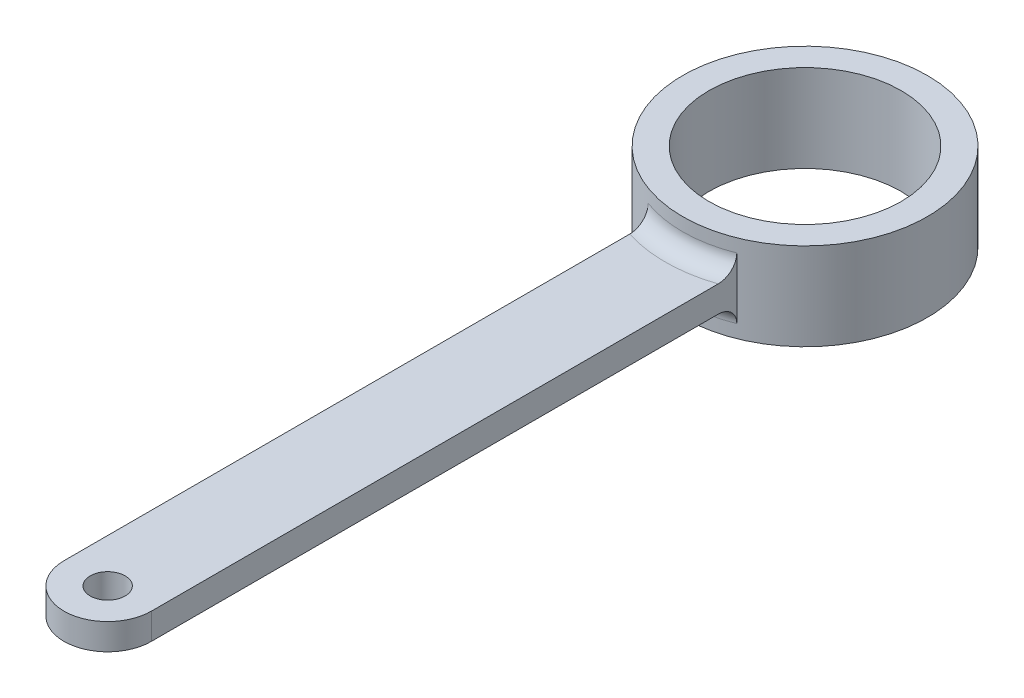
ISO-10303-21;
HEADER;
FILE_DESCRIPTION(('STEP AP214'),'2;1');
FILE_NAME('part.step','',(''),(''),'','','');
FILE_SCHEMA(('AUTOMOTIVE_DESIGN { 1 0 10303 214 1 1 1 1 }'));
ENDSEC;
DATA;
#1=APPLICATION_CONTEXT('core data for automotive mechanical design processes');
#2=APPLICATION_PROTOCOL_DEFINITION('international standard','automotive_design',2000,#1);
#3=PRODUCT_CONTEXT('',#1,'mechanical');
#4=PRODUCT('Part','Part','',(#3));
#5=PRODUCT_RELATED_PRODUCT_CATEGORY('part','',(#4));
#6=PRODUCT_DEFINITION_FORMATION('','',#4);
#7=PRODUCT_DEFINITION_CONTEXT('part definition',#1,'design');
#8=PRODUCT_DEFINITION('design','',#6,#7);
#9=PRODUCT_DEFINITION_SHAPE('','',#8);
#10=(LENGTH_UNIT() NAMED_UNIT(*) SI_UNIT(.MILLI.,.METRE.));
#11=(NAMED_UNIT(*) PLANE_ANGLE_UNIT() SI_UNIT($,.RADIAN.));
#12=(NAMED_UNIT(*) SI_UNIT($,.STERADIAN.) SOLID_ANGLE_UNIT());
#13=UNCERTAINTY_MEASURE_WITH_UNIT(LENGTH_MEASURE(1.E-05),#10,'distance_accuracy_value','');
#14=(GEOMETRIC_REPRESENTATION_CONTEXT(3) GLOBAL_UNCERTAINTY_ASSIGNED_CONTEXT((#13)) GLOBAL_UNIT_ASSIGNED_CONTEXT((#10,
#11,#12)) REPRESENTATION_CONTEXT('',''));
#15=CARTESIAN_POINT('',(0.,0.,0.));
#16=DIRECTION('',(0.,0.,1.));
#17=DIRECTION('',(1.,0.,0.));
#18=AXIS2_PLACEMENT_3D('',#15,#16,#17);
#19=CARTESIAN_POINT('',(0.,2.5,0.));
#20=DIRECTION('',(0.,-1.,0.));
#21=DIRECTION('',(0.,0.,-1.));
#22=AXIS2_PLACEMENT_3D('',#19,#20,#21);
#23=CYLINDRICAL_SURFACE('',#22,7.);
#24=CARTESIAN_POINT('',(0.,-2.5,0.));
#25=DIRECTION('',(0.,1.,0.));
#26=DIRECTION('',(0.,0.,1.));
#27=AXIS2_PLACEMENT_3D('',#24,#25,#26);
#28=CIRCLE('',#27,7.);
#29=CARTESIAN_POINT('',(0.,-2.5,7.));
#30=VERTEX_POINT('',#29);
#31=EDGE_CURVE('E122',#30,#30,#28,.T.);
#32=ORIENTED_EDGE('',*,*,#31,.T.);
#33=EDGE_LOOP('',(#32));
#34=FACE_BOUND('',#33,.T.);
#35=CARTESIAN_POINT('',(0.,2.5,0.));
#36=DIRECTION('',(0.,1.,0.));
#37=DIRECTION('',(0.,0.,1.));
#38=AXIS2_PLACEMENT_3D('',#35,#36,#37);
#39=CIRCLE('',#38,7.);
#40=CARTESIAN_POINT('',(0.,2.5,7.));
#41=VERTEX_POINT('',#40);
#42=EDGE_CURVE('E124',#41,#41,#39,.T.);
#43=ORIENTED_EDGE('',*,*,#42,.F.);
#44=EDGE_LOOP('',(#43));
#45=FACE_BOUND('',#44,.T.);
#46=CARTESIAN_POINT('',(0.,-1.75,0.));
#47=DIRECTION('',(0.,1.,0.));
#48=DIRECTION('',(0.,0.,1.));
#49=AXIS2_PLACEMENT_3D('',#46,#47,#48);
#50=CIRCLE('',#49,7.);
#51=CARTESIAN_POINT('',(2.59565300613237,-1.75,6.50096804112711));
#52=VERTEX_POINT('',#51);
#53=CARTESIAN_POINT('',(-2.40434699386764,-1.75,6.57412469710453));
#54=VERTEX_POINT('',#53);
#55=EDGE_CURVE('E132',#52,#54,#50,.F.);
#56=ORIENTED_EDGE('',*,*,#55,.T.);
#57=DIRECTION('',(0.,-1.,0.));
#58=VECTOR('',#57,1.);
#59=CARTESIAN_POINT('',(-2.40434699386764,0.75,6.57412469710453));
#60=LINE('',#59,#58);
#61=CARTESIAN_POINT('',(-2.40434699386764,1.75,6.57412469710453));
#62=VERTEX_POINT('',#61);
#63=EDGE_CURVE('E117',#62,#54,#60,.T.);
#64=ORIENTED_EDGE('',*,*,#63,.F.);
#65=CARTESIAN_POINT('',(0.,1.75,0.));
#66=DIRECTION('',(0.,1.,0.));
#67=DIRECTION('',(0.,0.,1.));
#68=AXIS2_PLACEMENT_3D('',#65,#66,#67);
#69=CIRCLE('',#68,7.);
#70=CARTESIAN_POINT('',(2.59565300613237,1.75,6.50096804112711));
#71=VERTEX_POINT('',#70);
#72=EDGE_CURVE('E127',#62,#71,#69,.T.);
#73=ORIENTED_EDGE('',*,*,#72,.T.);
#74=DIRECTION('',(0.,-1.,0.));
#75=VECTOR('',#74,1.);
#76=CARTESIAN_POINT('',(2.59565300613237,0.75,6.50096804112711));
#77=LINE('',#76,#75);
#78=EDGE_CURVE('E112',#71,#52,#77,.T.);
#79=ORIENTED_EDGE('',*,*,#78,.T.);
#80=EDGE_LOOP('',(#56,#64,#73,#79));
#81=FACE_BOUND('',#80,.T.);
#82=ADVANCED_FACE('F32',(#34,#45,#81),#23,.T.);
#83=CARTESIAN_POINT('',(0.,2.5,0.));
#84=DIRECTION('',(0.,1.,0.));
#85=DIRECTION('',(0.,0.,1.));
#86=AXIS2_PLACEMENT_3D('',#83,#84,#85);
#87=PLANE('',#86);
#88=ORIENTED_EDGE('',*,*,#42,.T.);
#89=EDGE_LOOP('',(#88));
#90=FACE_BOUND('',#89,.T.);
#91=CARTESIAN_POINT('',(0.,2.5,0.));
#92=DIRECTION('',(0.,1.,0.));
#93=DIRECTION('',(0.,0.,1.));
#94=AXIS2_PLACEMENT_3D('',#91,#92,#93);
#95=CIRCLE('',#94,5.5);
#96=CARTESIAN_POINT('',(0.,2.5,5.5));
#97=VERTEX_POINT('',#96);
#98=EDGE_CURVE('E115',#97,#97,#95,.T.);
#99=ORIENTED_EDGE('',*,*,#98,.F.);
#100=EDGE_LOOP('',(#99));
#101=FACE_BOUND('',#100,.T.);
#102=ADVANCED_FACE('F163',(#90,#101),#87,.T.);
#103=CARTESIAN_POINT('',(0.,-2.5,0.));
#104=DIRECTION('',(0.,1.,0.));
#105=DIRECTION('',(0.,0.,1.));
#106=AXIS2_PLACEMENT_3D('',#103,#104,#105);
#107=PLANE('',#106);
#108=ORIENTED_EDGE('',*,*,#31,.F.);
#109=EDGE_LOOP('',(#108));
#110=FACE_BOUND('',#109,.T.);
#111=CARTESIAN_POINT('',(0.,-2.5,0.));
#112=DIRECTION('',(0.,1.,0.));
#113=DIRECTION('',(0.,0.,1.));
#114=AXIS2_PLACEMENT_3D('',#111,#112,#113);
#115=CIRCLE('',#114,5.5);
#116=CARTESIAN_POINT('',(0.,-2.5,5.5));
#117=VERTEX_POINT('',#116);
#118=EDGE_CURVE('E111',#117,#117,#115,.T.);
#119=ORIENTED_EDGE('',*,*,#118,.T.);
#120=EDGE_LOOP('',(#119));
#121=FACE_BOUND('',#120,.T.);
#122=ADVANCED_FACE('F165',(#110,#121),#107,.F.);
#123=CARTESIAN_POINT('',(0.,2.5,0.));
#124=DIRECTION('',(0.,-1.,0.));
#125=DIRECTION('',(0.,0.,-1.));
#126=AXIS2_PLACEMENT_3D('',#123,#124,#125);
#127=CYLINDRICAL_SURFACE('',#126,5.5);
#128=ORIENTED_EDGE('',*,*,#98,.T.);
#129=EDGE_LOOP('',(#128));
#130=FACE_BOUND('',#129,.T.);
#131=ORIENTED_EDGE('',*,*,#118,.F.);
#132=EDGE_LOOP('',(#131));
#133=FACE_BOUND('',#132,.T.);
#134=ADVANCED_FACE('F168',(#130,#133),#127,.F.);
#135=CARTESIAN_POINT('',(0.0956530061323665,0.75,40.));
#136=DIRECTION('',(0.,1.,0.));
#137=DIRECTION('',(0.,0.,1.));
#138=AXIS2_PLACEMENT_3D('',#135,#136,#137);
#139=PLANE('',#138);
#140=DIRECTION('',(0.,0.,-1.));
#141=VECTOR('',#140,1.);
#142=CARTESIAN_POINT('',(2.59565300613237,0.75,40.));
#143=LINE('',#142,#141);
#144=CARTESIAN_POINT('',(2.59565300613237,0.75,40.));
#145=VERTEX_POINT('',#144);
#146=CARTESIAN_POINT('',(2.59565300613237,0.75,7.56720460089166));
#147=VERTEX_POINT('',#146);
#148=EDGE_CURVE('E88',#145,#147,#143,.T.);
#149=ORIENTED_EDGE('',*,*,#148,.T.);
#150=CARTESIAN_POINT('',(0.,0.75,0.));
#151=DIRECTION('',(0.,1.,0.));
#152=DIRECTION('',(0.,0.,1.));
#153=AXIS2_PLACEMENT_3D('',#150,#151,#152);
#154=CIRCLE('',#153,8.);
#155=CARTESIAN_POINT('',(-2.40434699386763,0.75,7.63014518427268));
#156=VERTEX_POINT('',#155);
#157=EDGE_CURVE('E137',#147,#156,#154,.F.);
#158=ORIENTED_EDGE('',*,*,#157,.T.);
#159=DIRECTION('',(0.,0.,1.));
#160=VECTOR('',#159,1.);
#161=CARTESIAN_POINT('',(-2.40434699386763,0.75,40.));
#162=LINE('',#161,#160);
#163=CARTESIAN_POINT('',(-2.40434699386763,0.75,40.));
#164=VERTEX_POINT('',#163);
#165=EDGE_CURVE('E96',#156,#164,#162,.T.);
#166=ORIENTED_EDGE('',*,*,#165,.T.);
#167=CARTESIAN_POINT('',(0.0956530061323665,0.75,40.));
#168=DIRECTION('',(0.,1.,0.));
#169=DIRECTION('',(0.,0.,1.));
#170=AXIS2_PLACEMENT_3D('',#167,#168,#169);
#171=CIRCLE('',#170,2.5);
#172=EDGE_CURVE('E97',#164,#145,#171,.T.);
#173=ORIENTED_EDGE('',*,*,#172,.T.);
#174=EDGE_LOOP('',(#149,#158,#166,#173));
#175=FACE_BOUND('',#174,.T.);
#176=CARTESIAN_POINT('',(0.0956530061323665,0.75,40.));
#177=DIRECTION('',(0.,1.,0.));
#178=DIRECTION('',(0.,0.,1.));
#179=AXIS2_PLACEMENT_3D('',#176,#177,#178);
#180=CIRCLE('',#179,1.);
#181=CARTESIAN_POINT('',(0.0956530061323665,0.75,41.));
#182=VERTEX_POINT('',#181);
#183=EDGE_CURVE('E206',#182,#182,#180,.T.);
#184=ORIENTED_EDGE('',*,*,#183,.F.);
#185=EDGE_LOOP('',(#184));
#186=FACE_BOUND('',#185,.T.);
#187=ADVANCED_FACE('F100',(#175,#186),#139,.T.);
#188=CARTESIAN_POINT('',(0.0956530061323665,-0.75,40.));
#189=DIRECTION('',(0.,1.,0.));
#190=DIRECTION('',(0.,0.,1.));
#191=AXIS2_PLACEMENT_3D('',#188,#189,#190);
#192=PLANE('',#191);
#193=DIRECTION('',(0.,0.,1.));
#194=VECTOR('',#193,1.);
#195=CARTESIAN_POINT('',(-2.40434699386763,-0.75,40.));
#196=LINE('',#195,#194);
#197=CARTESIAN_POINT('',(-2.40434699386763,-0.75,7.63014518427268));
#198=VERTEX_POINT('',#197);
#199=CARTESIAN_POINT('',(-2.40434699386763,-0.75,40.));
#200=VERTEX_POINT('',#199);
#201=EDGE_CURVE('E106',#198,#200,#196,.T.);
#202=ORIENTED_EDGE('',*,*,#201,.F.);
#203=CARTESIAN_POINT('',(0.,-0.75,0.));
#204=DIRECTION('',(0.,1.,0.));
#205=DIRECTION('',(0.,0.,1.));
#206=AXIS2_PLACEMENT_3D('',#203,#204,#205);
#207=CIRCLE('',#206,8.);
#208=CARTESIAN_POINT('',(2.59565300613237,-0.75,7.56720460089166));
#209=VERTEX_POINT('',#208);
#210=EDGE_CURVE('E135',#198,#209,#207,.T.);
#211=ORIENTED_EDGE('',*,*,#210,.T.);
#212=DIRECTION('',(0.,0.,-1.));
#213=VECTOR('',#212,1.);
#214=CARTESIAN_POINT('',(2.59565300613237,-0.75,40.));
#215=LINE('',#214,#213);
#216=CARTESIAN_POINT('',(2.59565300613237,-0.75,40.));
#217=VERTEX_POINT('',#216);
#218=EDGE_CURVE('E198',#217,#209,#215,.T.);
#219=ORIENTED_EDGE('',*,*,#218,.F.);
#220=CARTESIAN_POINT('',(0.0956530061323665,-0.75,40.));
#221=DIRECTION('',(0.,1.,0.));
#222=DIRECTION('',(0.,0.,1.));
#223=AXIS2_PLACEMENT_3D('',#220,#221,#222);
#224=CIRCLE('',#223,2.5);
#225=EDGE_CURVE('E110',#200,#217,#224,.T.);
#226=ORIENTED_EDGE('',*,*,#225,.F.);
#227=EDGE_LOOP('',(#202,#211,#219,#226));
#228=FACE_BOUND('',#227,.T.);
#229=CARTESIAN_POINT('',(0.0956530061323665,-0.75,40.));
#230=DIRECTION('',(0.,1.,0.));
#231=DIRECTION('',(0.,0.,1.));
#232=AXIS2_PLACEMENT_3D('',#229,#230,#231);
#233=CIRCLE('',#232,1.);
#234=CARTESIAN_POINT('',(0.0956530061323665,-0.75,41.));
#235=VERTEX_POINT('',#234);
#236=EDGE_CURVE('E211',#235,#235,#233,.T.);
#237=ORIENTED_EDGE('',*,*,#236,.T.);
#238=EDGE_LOOP('',(#237));
#239=FACE_BOUND('',#238,.T.);
#240=ADVANCED_FACE('F177',(#228,#239),#192,.F.);
#241=CARTESIAN_POINT('',(0.0956530061323665,0.75,40.));
#242=DIRECTION('',(0.,-1.,0.));
#243=DIRECTION('',(0.,0.,-1.));
#244=AXIS2_PLACEMENT_3D('',#241,#242,#243);
#245=CYLINDRICAL_SURFACE('',#244,2.5);
#246=ORIENTED_EDGE('',*,*,#225,.T.);
#247=DIRECTION('',(0.,-1.,0.));
#248=VECTOR('',#247,1.);
#249=CARTESIAN_POINT('',(2.59565300613237,0.75,40.));
#250=LINE('',#249,#248);
#251=EDGE_CURVE('E93',#145,#217,#250,.T.);
#252=ORIENTED_EDGE('',*,*,#251,.F.);
#253=ORIENTED_EDGE('',*,*,#172,.F.);
#254=DIRECTION('',(0.,-1.,0.));
#255=VECTOR('',#254,1.);
#256=CARTESIAN_POINT('',(-2.40434699386763,0.75,40.));
#257=LINE('',#256,#255);
#258=EDGE_CURVE('E193',#164,#200,#257,.T.);
#259=ORIENTED_EDGE('',*,*,#258,.T.);
#260=EDGE_LOOP('',(#246,#252,#253,#259));
#261=FACE_BOUND('',#260,.T.);
#262=ADVANCED_FACE('F108',(#261),#245,.T.);
#263=CARTESIAN_POINT('',(2.59565300613237,0.75,40.));
#264=DIRECTION('',(-1.,0.,0.));
#265=DIRECTION('',(0.,0.,1.));
#266=AXIS2_PLACEMENT_3D('',#263,#264,#265);
#267=PLANE('',#266);
#268=ORIENTED_EDGE('',*,*,#218,.T.);
#269=CARTESIAN_POINT('',(2.59565300613237,-0.75,7.56720460089167));
#270=CARTESIAN_POINT('',(2.59565300613237,-0.749967191618016,7.50451355800079));
#271=CARTESIAN_POINT('',(2.59565300613237,-0.755273207592061,7.44183053267779));
#272=CARTESIAN_POINT('',(2.59565300613237,-0.776246098878356,7.31818058480668));
#273=CARTESIAN_POINT('',(2.59565300613237,-0.7919195489353,7.257214776867));
#274=CARTESIAN_POINT('',(2.59565300613237,-0.833324359570755,7.13874151829163));
#275=CARTESIAN_POINT('',(2.59565300613237,-0.859062815961786,7.08123654061144));
#276=CARTESIAN_POINT('',(2.59565300613237,-0.920018319774298,6.97150578878896));
#277=CARTESIAN_POINT('',(2.59565300613237,-0.955231011299848,6.91927760371744));
#278=CARTESIAN_POINT('',(2.59565300613237,-1.03348483079806,6.82289538224537));
#279=CARTESIAN_POINT('',(2.59565300613237,-1.07634150943895,6.778591980932));
#280=CARTESIAN_POINT('',(2.59565300613237,-1.16932522605815,6.69836401329832));
#281=CARTESIAN_POINT('',(2.59565300613237,-1.21945182168122,6.66243893752565));
#282=CARTESIAN_POINT('',(2.59565300613237,-1.32229167777913,6.60241340638298));
#283=CARTESIAN_POINT('',(2.59565300613237,-1.374663910087,6.57772814209444));
#284=CARTESIAN_POINT('',(2.59565300613237,-1.48297093006899,6.53823930053503));
#285=CARTESIAN_POINT('',(2.59565300613237,-1.53889950472845,6.52341898181601));
#286=CARTESIAN_POINT('',(2.59565300613237,-1.62115839328606,6.50957782979631));
#287=CARTESIAN_POINT('',(2.59565300613237,-1.64683833681778,6.50635060117731));
#288=CARTESIAN_POINT('',(2.59565300613237,-1.69834080136864,6.5020473204653));
#289=CARTESIAN_POINT('',(2.59565300613237,-1.72416306599135,6.50096819881171));
#290=CARTESIAN_POINT('',(2.59565300613237,-1.75,6.5009680411271));
#291=B_SPLINE_CURVE_WITH_KNOTS('',3,(#269,#270,#271,#272,#273,#274,#275,#276,#277,#278,#279,
#280,#281,#282,#283,#284,#285,#286,#287,#288,#289,#290),.UNSPECIFIED.,.F.,.F.,(4,2,2,2,2,2,2,2,
2,2,4),(0.,0.187841420387833,0.375802079050729,0.563895489254461,0.751902568540989,
0.935870295355445,1.11982683291239,1.29263149814454,1.46514214992459,1.54271242813209,
1.62017178165606),.UNSPECIFIED.);
#292=EDGE_CURVE('E146',#209,#52,#291,.T.);
#293=ORIENTED_EDGE('',*,*,#292,.T.);
#294=ORIENTED_EDGE('',*,*,#78,.F.);
#295=CARTESIAN_POINT('',(2.59565300613237,1.75,6.50096804112711));
#296=CARTESIAN_POINT('',(2.59565300613237,1.72324971361133,6.50096701285888));
#297=CARTESIAN_POINT('',(2.59565300613237,1.69651287144223,6.50212461765312));
#298=CARTESIAN_POINT('',(2.59565300613237,1.64324340133514,6.5067346327404));
#299=CARTESIAN_POINT('',(2.59565300613237,1.61671073109249,6.51018655394862));
#300=CARTESIAN_POINT('',(2.59565300613237,1.53786290085643,6.52391687239184));
#301=CARTESIAN_POINT('',(2.59565300613237,1.48609725780734,6.53757020814757));
#302=CARTESIAN_POINT('',(2.59565300613237,1.38563070411865,6.57331935013671));
#303=CARTESIAN_POINT('',(2.59565300613237,1.33692883992691,6.5954125143164));
#304=CARTESIAN_POINT('',(2.59565300613237,1.24374381278024,6.64721647019553));
#305=CARTESIAN_POINT('',(2.59565300613237,1.19926252393207,6.67693062443859));
#306=CARTESIAN_POINT('',(2.59565300613237,1.11418748567707,6.74403895577305));
#307=CARTESIAN_POINT('',(2.59565300613237,1.07376472992852,6.78164936008533));
#308=CARTESIAN_POINT('',(2.59565300613237,0.999322222231609,6.86274483930424));
#309=CARTESIAN_POINT('',(2.59565300613237,0.965304368131877,6.90623164892372));
#310=CARTESIAN_POINT('',(2.59565300613237,0.902274467115865,7.00092831294896));
#311=CARTESIAN_POINT('',(2.59565300613237,0.873744982748008,7.05245928550288));
#312=CARTESIAN_POINT('',(2.59565300613237,0.825238076681609,7.15940258363923));
#313=CARTESIAN_POINT('',(2.59565300613237,0.805261730380197,7.21481539627186));
#314=CARTESIAN_POINT('',(2.59565300613237,0.776574642902735,7.31958704762955));
#315=CARTESIAN_POINT('',(2.59565300613237,0.766625698749371,7.36861152810742));
#316=CARTESIAN_POINT('',(2.59565300613237,0.753337021663266,7.46748835478582));
#317=CARTESIAN_POINT('',(2.59565300613237,0.749989433896567,7.5173396458344));
#318=CARTESIAN_POINT('',(2.59565300613237,0.75,7.56720460089167));
#319=B_SPLINE_CURVE_WITH_KNOTS('',3,(#295,#296,#297,#298,#299,#300,#301,#302,#303,#304,#305,
#306,#307,#308,#309,#310,#311,#312,#313,#314,#315,#316,#317,#318),.UNSPECIFIED.,.F.,.F.,(4,2,2,
2,2,2,2,2,2,2,2,4),(0.,0.080199452112484,0.160381813399797,0.320152520407001,0.479873252780814,
0.639664578953307,0.804593963599952,0.969572142139731,1.14550822520554,1.32146642245181,
1.47110319379581,1.62056180737287),.UNSPECIFIED.);
#320=EDGE_CURVE('E11',#71,#147,#319,.T.);
#321=ORIENTED_EDGE('',*,*,#320,.T.);
#322=ORIENTED_EDGE('',*,*,#148,.F.);
#323=ORIENTED_EDGE('',*,*,#251,.T.);
#324=EDGE_LOOP('',(#268,#293,#294,#321,#322,#323));
#325=FACE_BOUND('',#324,.T.);
#326=ADVANCED_FACE('F91',(#325),#267,.F.);
#327=CARTESIAN_POINT('',(-2.40434699386763,0.75,40.));
#328=DIRECTION('',(1.,0.,0.));
#329=DIRECTION('',(0.,0.,-1.));
#330=AXIS2_PLACEMENT_3D('',#327,#328,#329);
#331=PLANE('',#330);
#332=ORIENTED_EDGE('',*,*,#63,.T.);
#333=CARTESIAN_POINT('',(-2.40434699386764,-1.75,6.57412469710453));
#334=CARTESIAN_POINT('',(-2.40434699386764,-1.72304858983152,6.57412384620897));
#335=CARTESIAN_POINT('',(-2.40434699386763,-1.69611062042336,6.57528565327569));
#336=CARTESIAN_POINT('',(-2.40434699386763,-1.64243838384408,6.57991362086383));
#337=CARTESIAN_POINT('',(-2.40434699386763,-1.6157040793063,6.58337934785501));
#338=CARTESIAN_POINT('',(-2.40434699386763,-1.53623784052171,6.59717017570939));
#339=CARTESIAN_POINT('',(-2.40434699386763,-1.48405623875785,6.61088925405417));
#340=CARTESIAN_POINT('',(-2.40434699386763,-1.3827686683026,6.64684435848325));
#341=CARTESIAN_POINT('',(-2.40434699386763,-1.33366210167369,6.66907872275772));
#342=CARTESIAN_POINT('',(-2.40434699386763,-1.23972102714485,6.72126216724701));
#343=CARTESIAN_POINT('',(-2.40434699386763,-1.19488803957112,6.75121397901628));
#344=CARTESIAN_POINT('',(-2.40434699386763,-1.10938304187433,6.81876957526786));
#345=CARTESIAN_POINT('',(-2.40434699386763,-1.0688606216883,6.85656227539508));
#346=CARTESIAN_POINT('',(-2.40434699386763,-0.994315568071022,6.93809069449535));
#347=CARTESIAN_POINT('',(-2.40434699386763,-0.960294817881679,6.98182812913247));
#348=CARTESIAN_POINT('',(-2.40434699386763,-0.897707232201834,7.07664580519353));
#349=CARTESIAN_POINT('',(-2.40434699386763,-0.869557774641766,7.12800145652281));
#350=CARTESIAN_POINT('',(-2.40434699386763,-0.821854661558519,7.23456055686268));
#351=CARTESIAN_POINT('',(-2.40434699386763,-0.802301208591336,7.28976409650927));
#352=CARTESIAN_POINT('',(-2.40434699386763,-0.774894416678548,7.3924396270475));
#353=CARTESIAN_POINT('',(-2.40434699386763,-0.765573055833443,7.43952624135226));
#354=CARTESIAN_POINT('',(-2.40434699386763,-0.753124668655996,7.5344527147288));
#355=CARTESIAN_POINT('',(-2.40434699386763,-0.749990133734796,7.58229158962735));
#356=CARTESIAN_POINT('',(-2.40434699386763,-0.75,7.63014518427269));
#357=B_SPLINE_CURVE_WITH_KNOTS('',3,(#333,#334,#335,#336,#337,#338,#339,#340,#341,#342,#343,
#344,#345,#346,#347,#348,#349,#350,#351,#352,#353,#354,#355,#356),.UNSPECIFIED.,.F.,.F.,(4,2,2,
2,2,2,2,2,2,2,2,4),(0.,0.0808027864681223,0.161590372521452,0.322613876638009,0.483605972038513,
0.64465512830154,0.810163672709614,0.975720085091735,1.15064163158965,1.32556729971277,
1.46917331905182,1.61260494473333),.UNSPECIFIED.);
#358=EDGE_CURVE('E139',#54,#198,#357,.T.);
#359=ORIENTED_EDGE('',*,*,#358,.T.);
#360=ORIENTED_EDGE('',*,*,#201,.T.);
#361=ORIENTED_EDGE('',*,*,#258,.F.);
#362=ORIENTED_EDGE('',*,*,#165,.F.);
#363=CARTESIAN_POINT('',(-2.40434699386763,0.75,7.63014518427269));
#364=CARTESIAN_POINT('',(-2.40434699386763,0.74996461614881,7.56847490876169));
#365=CARTESIAN_POINT('',(-2.40434699386763,0.755187855954402,7.50681359950979));
#366=CARTESIAN_POINT('',(-2.40434699386763,0.775829122943631,7.38519453380251));
#367=CARTESIAN_POINT('',(-2.40434699386763,0.791251326927976,7.32523748579309));
#368=CARTESIAN_POINT('',(-2.40434699386763,0.8319812837931,7.20872664570127));
#369=CARTESIAN_POINT('',(-2.40434699386763,0.857295694963676,7.15217517551068));
#370=CARTESIAN_POINT('',(-2.40434699386763,0.917213269774785,7.04424290904672));
#371=CARTESIAN_POINT('',(-2.40434699386763,0.951812540171268,6.99285995794327));
#372=CARTESIAN_POINT('',(-2.40434699386763,1.02878581642799,6.89779918823012));
#373=CARTESIAN_POINT('',(-2.40434699386763,1.07100918120565,6.8539996594116));
#374=CARTESIAN_POINT('',(-2.40434699386763,1.16257614915583,6.77456571534452));
#375=CARTESIAN_POINT('',(-2.40434699386763,1.21191970943735,6.73893125091416));
#376=CARTESIAN_POINT('',(-2.40434699386763,1.31362121619751,6.67886611861998));
#377=CARTESIAN_POINT('',(-2.40434699386763,1.36569622673537,6.65395593476203));
#378=CARTESIAN_POINT('',(-2.40434699386763,1.47342714771799,6.61385240628448));
#379=CARTESIAN_POINT('',(-2.40434699386763,1.52907749315806,6.59864434517991));
#380=CARTESIAN_POINT('',(-2.40434699386763,1.612730792757,6.58379422795612));
#381=CARTESIAN_POINT('',(-2.40434699386763,1.64007770012551,6.58016998709225));
#382=CARTESIAN_POINT('',(-2.40434699386763,1.69494476780129,6.5753367259632));
#383=CARTESIAN_POINT('',(-2.40434699386763,1.72246462571815,6.57412427162028));
#384=CARTESIAN_POINT('',(-2.40434699386763,1.75,6.57412469710451));
#385=B_SPLINE_CURVE_WITH_KNOTS('',3,(#363,#364,#365,#366,#367,#368,#369,#370,#371,#372,#373,
#374,#375,#376,#377,#378,#379,#380,#381,#382,#383,#384),.UNSPECIFIED.,.F.,.F.,(4,2,2,2,2,2,2,2,
2,2,4),(0.,0.184780441000396,0.369636602378356,0.554617402453264,0.739520758904971,
0.921106400054528,1.10269094740462,1.27499529825982,1.44703766711833,1.52970438216945,
1.6122533058188),.UNSPECIFIED.);
#386=EDGE_CURVE('E46',#156,#62,#385,.T.);
#387=ORIENTED_EDGE('',*,*,#386,.T.);
#388=EDGE_LOOP('',(#332,#359,#360,#361,#362,#387));
#389=FACE_BOUND('',#388,.T.);
#390=ADVANCED_FACE('F151',(#389),#331,.F.);
#391=CARTESIAN_POINT('',(0.0956530061323665,0.75,40.));
#392=DIRECTION('',(0.,-1.,0.));
#393=DIRECTION('',(0.,0.,-1.));
#394=AXIS2_PLACEMENT_3D('',#391,#392,#393);
#395=CYLINDRICAL_SURFACE('',#394,1.);
#396=ORIENTED_EDGE('',*,*,#183,.T.);
#397=EDGE_LOOP('',(#396));
#398=FACE_BOUND('',#397,.T.);
#399=ORIENTED_EDGE('',*,*,#236,.F.);
#400=EDGE_LOOP('',(#399));
#401=FACE_BOUND('',#400,.T.);
#402=ADVANCED_FACE('F158',(#398,#401),#395,.F.);
#403=CARTESIAN_POINT('',(0.,-1.75,0.));
#404=DIRECTION('',(0.,1.,0.));
#405=DIRECTION('',(0.,0.,1.));
#406=AXIS2_PLACEMENT_3D('',#403,#404,#405);
#407=TOROIDAL_SURFACE('',#406,8.,1.);
#408=ORIENTED_EDGE('',*,*,#292,.F.);
#409=ORIENTED_EDGE('',*,*,#210,.F.);
#410=ORIENTED_EDGE('',*,*,#358,.F.);
#411=ORIENTED_EDGE('',*,*,#55,.F.);
#412=EDGE_LOOP('',(#408,#409,#410,#411));
#413=FACE_BOUND('',#412,.T.);
#414=ADVANCED_FACE('F154',(#413),#407,.F.);
#415=CARTESIAN_POINT('',(0.,1.75,0.));
#416=DIRECTION('',(0.,1.,0.));
#417=DIRECTION('',(0.,0.,1.));
#418=AXIS2_PLACEMENT_3D('',#415,#416,#417);
#419=TOROIDAL_SURFACE('',#418,8.,1.);
#420=ORIENTED_EDGE('',*,*,#320,.F.);
#421=ORIENTED_EDGE('',*,*,#72,.F.);
#422=ORIENTED_EDGE('',*,*,#386,.F.);
#423=ORIENTED_EDGE('',*,*,#157,.F.);
#424=EDGE_LOOP('',(#420,#421,#422,#423));
#425=FACE_BOUND('',#424,.T.);
#426=ADVANCED_FACE('F34',(#425),#419,.F.);
#427=CLOSED_SHELL('',(#82,#102,#122,#134,#187,#240,#262,#326,#390,#402,#414,#426));
#428=MANIFOLD_SOLID_BREP('B2',#427);
#429=ADVANCED_BREP_SHAPE_REPRESENTATION('',(#18,#428),#14);
#430=SHAPE_DEFINITION_REPRESENTATION(#9,#429);
ENDSEC;
END-ISO-10303-21;
